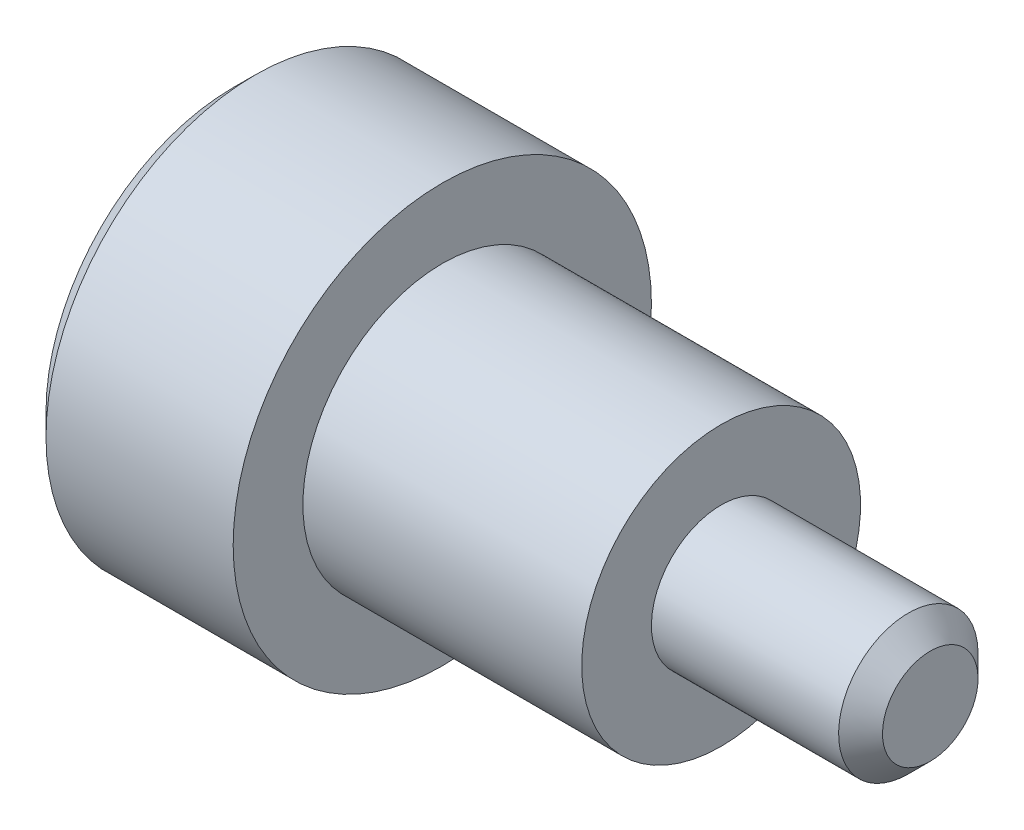
ISO-10303-21;
HEADER;
FILE_DESCRIPTION(('STEP AP214'),'2;1');
FILE_NAME('part.step','',(''),(''),'','','');
FILE_SCHEMA(('AUTOMOTIVE_DESIGN { 1 0 10303 214 1 1 1 1 }'));
ENDSEC;
DATA;
#1=APPLICATION_CONTEXT('core data for automotive mechanical design processes');
#2=APPLICATION_PROTOCOL_DEFINITION('international standard','automotive_design',2000,#1);
#3=PRODUCT_CONTEXT('',#1,'mechanical');
#4=PRODUCT('Part','Part','',(#3));
#5=PRODUCT_RELATED_PRODUCT_CATEGORY('part','',(#4));
#6=PRODUCT_DEFINITION_FORMATION('','',#4);
#7=PRODUCT_DEFINITION_CONTEXT('part definition',#1,'design');
#8=PRODUCT_DEFINITION('design','',#6,#7);
#9=PRODUCT_DEFINITION_SHAPE('','',#8);
#10=(LENGTH_UNIT() NAMED_UNIT(*) SI_UNIT(.MILLI.,.METRE.));
#11=(NAMED_UNIT(*) PLANE_ANGLE_UNIT() SI_UNIT($,.RADIAN.));
#12=(NAMED_UNIT(*) SI_UNIT($,.STERADIAN.) SOLID_ANGLE_UNIT());
#13=UNCERTAINTY_MEASURE_WITH_UNIT(LENGTH_MEASURE(1.E-05),#10,'distance_accuracy_value','');
#14=(GEOMETRIC_REPRESENTATION_CONTEXT(3) GLOBAL_UNCERTAINTY_ASSIGNED_CONTEXT((#13)) GLOBAL_UNIT_ASSIGNED_CONTEXT((#10,
#11,#12)) REPRESENTATION_CONTEXT('',''));
#15=CARTESIAN_POINT('',(0.,0.,0.));
#16=DIRECTION('',(0.,0.,1.));
#17=DIRECTION('',(1.,0.,0.));
#18=AXIS2_PLACEMENT_3D('',#15,#16,#17);
#19=CARTESIAN_POINT('',(0.,0.,0.));
#20=DIRECTION('',(1.,0.,0.));
#21=DIRECTION('',(0.,1.,0.));
#22=AXIS2_PLACEMENT_3D('',#19,#20,#21);
#23=PLANE('',#22);
#24=CARTESIAN_POINT('',(0.,0.,0.));
#25=DIRECTION('',(-1.,0.,0.));
#26=DIRECTION('',(0.,-1.,0.));
#27=AXIS2_PLACEMENT_3D('',#24,#25,#26);
#28=CIRCLE('',#27,4.2625);
#29=CARTESIAN_POINT('',(0.,-4.2625,0.));
#30=VERTEX_POINT('',#29);
#31=EDGE_CURVE('E11',#30,#30,#28,.T.);
#32=ORIENTED_EDGE('',*,*,#31,.T.);
#33=EDGE_LOOP('',(#32));
#34=FACE_BOUND('',#33,.T.);
#35=DIRECTION('',(0.,-0.5,-0.866025403784438));
#36=VECTOR('',#35,1.);
#37=CARTESIAN_POINT('',(0.,-0.57735026918963,1.));
#38=LINE('',#37,#36);
#39=CARTESIAN_POINT('',(0.,-0.57735026918963,1.));
#40=VERTEX_POINT('',#39);
#41=CARTESIAN_POINT('',(0.,-1.15470053837927,0.));
#42=VERTEX_POINT('',#41);
#43=EDGE_CURVE('E218',#40,#42,#38,.T.);
#44=ORIENTED_EDGE('',*,*,#43,.T.);
#45=DIRECTION('',(0.,0.5,-0.866025403784438));
#46=VECTOR('',#45,1.);
#47=CARTESIAN_POINT('',(0.,-1.15470053837927,0.));
#48=LINE('',#47,#46);
#49=CARTESIAN_POINT('',(0.,-0.57735026918963,-1.00000000000004));
#50=VERTEX_POINT('',#49);
#51=EDGE_CURVE('E221',#42,#50,#48,.T.);
#52=ORIENTED_EDGE('',*,*,#51,.T.);
#53=DIRECTION('',(0.,1.,0.));
#54=VECTOR('',#53,1.);
#55=CARTESIAN_POINT('',(0.,-0.57735026918963,-1.00000000000004));
#56=LINE('',#55,#54);
#57=CARTESIAN_POINT('',(0.,0.57735026918963,-1.00000000000004));
#58=VERTEX_POINT('',#57);
#59=EDGE_CURVE('E237',#50,#58,#56,.T.);
#60=ORIENTED_EDGE('',*,*,#59,.T.);
#61=DIRECTION('',(0.,0.5,0.866025403784438));
#62=VECTOR('',#61,1.);
#63=CARTESIAN_POINT('',(0.,0.57735026918963,-1.00000000000004));
#64=LINE('',#63,#62);
#65=CARTESIAN_POINT('',(0.,1.15470053837927,0.));
#66=VERTEX_POINT('',#65);
#67=EDGE_CURVE('E116',#58,#66,#64,.T.);
#68=ORIENTED_EDGE('',*,*,#67,.T.);
#69=DIRECTION('',(0.,-0.5,0.866025403784438));
#70=VECTOR('',#69,1.);
#71=CARTESIAN_POINT('',(0.,1.15470053837927,0.));
#72=LINE('',#71,#70);
#73=CARTESIAN_POINT('',(0.,0.57735026918963,1.));
#74=VERTEX_POINT('',#73);
#75=EDGE_CURVE('E256',#66,#74,#72,.T.);
#76=ORIENTED_EDGE('',*,*,#75,.T.);
#77=DIRECTION('',(0.,-1.,0.));
#78=VECTOR('',#77,1.);
#79=CARTESIAN_POINT('',(0.,0.57735026918963,1.));
#80=LINE('',#79,#78);
#81=EDGE_CURVE('E131',#74,#40,#80,.T.);
#82=ORIENTED_EDGE('',*,*,#81,.T.);
#83=EDGE_LOOP('',(#44,#52,#60,#68,#76,#82));
#84=FACE_BOUND('',#83,.T.);
#85=ADVANCED_FACE('F33',(#34,#84),#23,.F.);
#86=CARTESIAN_POINT('',(0.499999999999997,0.,0.));
#87=DIRECTION('',(1.,0.,0.));
#88=DIRECTION('',(0.,1.,0.));
#89=AXIS2_PLACEMENT_3D('',#86,#87,#88);
#90=CONICAL_SURFACE('',#89,4.7625,0.785398163397453);
#91=ORIENTED_EDGE('',*,*,#31,.F.);
#92=EDGE_LOOP('',(#91));
#93=FACE_BOUND('',#92,.T.);
#94=CARTESIAN_POINT('',(0.499999999999997,0.,0.));
#95=DIRECTION('',(-1.,0.,0.));
#96=DIRECTION('',(0.,-1.,0.));
#97=AXIS2_PLACEMENT_3D('',#94,#95,#96);
#98=CIRCLE('',#97,4.7625);
#99=CARTESIAN_POINT('',(0.499999999999998,-4.7625,0.));
#100=VERTEX_POINT('',#99);
#101=EDGE_CURVE('E40',#100,#100,#98,.T.);
#102=ORIENTED_EDGE('',*,*,#101,.T.);
#103=EDGE_LOOP('',(#102));
#104=FACE_BOUND('',#103,.T.);
#105=ADVANCED_FACE('F163',(#93,#104),#90,.T.);
#106=CARTESIAN_POINT('',(15.875,0.,0.));
#107=DIRECTION('',(-1.,0.,0.));
#108=DIRECTION('',(0.,-1.,0.));
#109=AXIS2_PLACEMENT_3D('',#106,#107,#108);
#110=CYLINDRICAL_SURFACE('',#109,4.7625);
#111=ORIENTED_EDGE('',*,*,#101,.F.);
#112=EDGE_LOOP('',(#111));
#113=FACE_BOUND('',#112,.T.);
#114=CARTESIAN_POINT('',(4.7625,0.,0.));
#115=DIRECTION('',(-1.,0.,0.));
#116=DIRECTION('',(0.,-1.,0.));
#117=AXIS2_PLACEMENT_3D('',#114,#115,#116);
#118=CIRCLE('',#117,4.7625);
#119=CARTESIAN_POINT('',(4.7625,-4.7625,0.));
#120=VERTEX_POINT('',#119);
#121=EDGE_CURVE('E158',#120,#120,#118,.T.);
#122=ORIENTED_EDGE('',*,*,#121,.T.);
#123=EDGE_LOOP('',(#122));
#124=FACE_BOUND('',#123,.T.);
#125=ADVANCED_FACE('F165',(#113,#124),#110,.T.);
#126=CARTESIAN_POINT('',(4.7625,4.7625,0.));
#127=DIRECTION('',(-1.,0.,0.));
#128=DIRECTION('',(0.,-1.,0.));
#129=AXIS2_PLACEMENT_3D('',#126,#127,#128);
#130=PLANE('',#129);
#131=ORIENTED_EDGE('',*,*,#121,.F.);
#132=EDGE_LOOP('',(#131));
#133=FACE_BOUND('',#132,.T.);
#134=CARTESIAN_POINT('',(4.7625,0.,0.));
#135=DIRECTION('',(-1.,0.,0.));
#136=DIRECTION('',(0.,-1.,0.));
#137=AXIS2_PLACEMENT_3D('',#134,#135,#136);
#138=CIRCLE('',#137,3.175);
#139=CARTESIAN_POINT('',(4.7625,-3.175,0.));
#140=VERTEX_POINT('',#139);
#141=EDGE_CURVE('E155',#140,#140,#138,.T.);
#142=ORIENTED_EDGE('',*,*,#141,.T.);
#143=EDGE_LOOP('',(#142));
#144=FACE_BOUND('',#143,.T.);
#145=ADVANCED_FACE('F168',(#133,#144),#130,.F.);
#146=CARTESIAN_POINT('',(15.875,0.,0.));
#147=DIRECTION('',(-1.,0.,0.));
#148=DIRECTION('',(0.,-1.,0.));
#149=AXIS2_PLACEMENT_3D('',#146,#147,#148);
#150=CYLINDRICAL_SURFACE('',#149,3.175);
#151=ORIENTED_EDGE('',*,*,#141,.F.);
#152=EDGE_LOOP('',(#151));
#153=FACE_BOUND('',#152,.T.);
#154=CARTESIAN_POINT('',(11.1125,0.,0.));
#155=DIRECTION('',(-1.,0.,0.));
#156=DIRECTION('',(0.,-1.,0.));
#157=AXIS2_PLACEMENT_3D('',#154,#155,#156);
#158=CIRCLE('',#157,3.175);
#159=CARTESIAN_POINT('',(11.1125,-3.175,0.));
#160=VERTEX_POINT('',#159);
#161=EDGE_CURVE('E152',#160,#160,#158,.T.);
#162=ORIENTED_EDGE('',*,*,#161,.T.);
#163=EDGE_LOOP('',(#162));
#164=FACE_BOUND('',#163,.T.);
#165=ADVANCED_FACE('F174',(#153,#164),#150,.T.);
#166=CARTESIAN_POINT('',(11.1125,3.175,0.));
#167=DIRECTION('',(-1.,0.,0.));
#168=DIRECTION('',(0.,-1.,0.));
#169=AXIS2_PLACEMENT_3D('',#166,#167,#168);
#170=PLANE('',#169);
#171=ORIENTED_EDGE('',*,*,#161,.F.);
#172=EDGE_LOOP('',(#171));
#173=FACE_BOUND('',#172,.T.);
#174=CARTESIAN_POINT('',(11.1125,0.,0.));
#175=DIRECTION('',(-1.,0.,0.));
#176=DIRECTION('',(0.,-1.,0.));
#177=AXIS2_PLACEMENT_3D('',#174,#175,#176);
#178=CIRCLE('',#177,1.5875);
#179=CARTESIAN_POINT('',(11.1125,-1.5875,0.));
#180=VERTEX_POINT('',#179);
#181=EDGE_CURVE('E149',#180,#180,#178,.T.);
#182=ORIENTED_EDGE('',*,*,#181,.T.);
#183=EDGE_LOOP('',(#182));
#184=FACE_BOUND('',#183,.T.);
#185=ADVANCED_FACE('F180',(#173,#184),#170,.F.);
#186=CARTESIAN_POINT('',(15.875,0.,0.));
#187=DIRECTION('',(-1.,0.,0.));
#188=DIRECTION('',(0.,-1.,0.));
#189=AXIS2_PLACEMENT_3D('',#186,#187,#188);
#190=CYLINDRICAL_SURFACE('',#189,1.5875);
#191=ORIENTED_EDGE('',*,*,#181,.F.);
#192=EDGE_LOOP('',(#191));
#193=FACE_BOUND('',#192,.T.);
#194=CARTESIAN_POINT('',(15.375,0.,0.));
#195=DIRECTION('',(-1.,0.,0.));
#196=DIRECTION('',(0.,-1.,0.));
#197=AXIS2_PLACEMENT_3D('',#194,#195,#196);
#198=CIRCLE('',#197,1.5875);
#199=CARTESIAN_POINT('',(15.375,-1.5875,0.));
#200=VERTEX_POINT('',#199);
#201=EDGE_CURVE('E146',#200,#200,#198,.T.);
#202=ORIENTED_EDGE('',*,*,#201,.T.);
#203=EDGE_LOOP('',(#202));
#204=FACE_BOUND('',#203,.T.);
#205=ADVANCED_FACE('F186',(#193,#204),#190,.T.);
#206=CARTESIAN_POINT('',(15.875,0.,0.));
#207=DIRECTION('',(-1.,0.,0.));
#208=DIRECTION('',(0.,-1.,0.));
#209=AXIS2_PLACEMENT_3D('',#206,#207,#208);
#210=CONICAL_SURFACE('',#209,1.0875,0.785398163397447);
#211=ORIENTED_EDGE('',*,*,#201,.F.);
#212=EDGE_LOOP('',(#211));
#213=FACE_BOUND('',#212,.T.);
#214=CARTESIAN_POINT('',(15.875,0.,0.));
#215=DIRECTION('',(-1.,0.,0.));
#216=DIRECTION('',(0.,-1.,0.));
#217=AXIS2_PLACEMENT_3D('',#214,#215,#216);
#218=CIRCLE('',#217,1.0875);
#219=CARTESIAN_POINT('',(15.875,-1.0875,0.));
#220=VERTEX_POINT('',#219);
#221=EDGE_CURVE('E143',#220,#220,#218,.T.);
#222=ORIENTED_EDGE('',*,*,#221,.T.);
#223=EDGE_LOOP('',(#222));
#224=FACE_BOUND('',#223,.T.);
#225=ADVANCED_FACE('F192',(#213,#224),#210,.T.);
#226=CARTESIAN_POINT('',(15.875,1.0875,0.));
#227=DIRECTION('',(-1.,0.,0.));
#228=DIRECTION('',(0.,-1.,0.));
#229=AXIS2_PLACEMENT_3D('',#226,#227,#228);
#230=PLANE('',#229);
#231=ORIENTED_EDGE('',*,*,#221,.F.);
#232=EDGE_LOOP('',(#231));
#233=FACE_BOUND('',#232,.T.);
#234=ADVANCED_FACE('F198',(#233),#230,.F.);
#235=CARTESIAN_POINT('',(2.,1.15470053837927,0.));
#236=DIRECTION('',(0.,-0.866025403784439,-0.5));
#237=DIRECTION('',(0.,0.5,-0.866025403784438));
#238=AXIS2_PLACEMENT_3D('',#235,#236,#237);
#239=PLANE('',#238);
#240=DIRECTION('',(0.,-0.5,0.866025403784438));
#241=VECTOR('',#240,1.);
#242=CARTESIAN_POINT('',(2.,1.15470053837927,0.));
#243=LINE('',#242,#241);
#244=CARTESIAN_POINT('',(2.,1.15470053837927,0.));
#245=VERTEX_POINT('',#244);
#246=CARTESIAN_POINT('',(2.,0.866025403784442,0.500000000000002));
#247=VERTEX_POINT('',#246);
#248=EDGE_CURVE('E113',#245,#247,#243,.T.);
#249=ORIENTED_EDGE('',*,*,#248,.T.);
#250=CARTESIAN_POINT('',(2.,0.57735026918963,1.));
#251=VERTEX_POINT('',#250);
#252=EDGE_CURVE('E105',#247,#251,#243,.T.);
#253=ORIENTED_EDGE('',*,*,#252,.T.);
#254=DIRECTION('',(-1.,0.,0.));
#255=VECTOR('',#254,1.);
#256=CARTESIAN_POINT('',(2.,0.57735026918963,1.));
#257=LINE('',#256,#255);
#258=EDGE_CURVE('E110',#251,#74,#257,.T.);
#259=ORIENTED_EDGE('',*,*,#258,.T.);
#260=ORIENTED_EDGE('',*,*,#75,.F.);
#261=DIRECTION('',(-1.,0.,0.));
#262=VECTOR('',#261,1.);
#263=CARTESIAN_POINT('',(2.,1.15470053837927,0.));
#264=LINE('',#263,#262);
#265=EDGE_CURVE('E243',#245,#66,#264,.T.);
#266=ORIENTED_EDGE('',*,*,#265,.F.);
#267=EDGE_LOOP('',(#249,#253,#259,#260,#266));
#268=FACE_BOUND('',#267,.T.);
#269=ADVANCED_FACE('F107',(#268),#239,.T.);
#270=CARTESIAN_POINT('',(2.,0.57735026918963,1.));
#271=DIRECTION('',(0.,0.,-1.));
#272=DIRECTION('',(-1.,0.,0.));
#273=AXIS2_PLACEMENT_3D('',#270,#271,#272);
#274=PLANE('',#273);
#275=DIRECTION('',(0.,-1.,0.));
#276=VECTOR('',#275,1.);
#277=CARTESIAN_POINT('',(2.,0.57735026918963,1.));
#278=LINE('',#277,#276);
#279=CARTESIAN_POINT('',(2.,0.,1.));
#280=VERTEX_POINT('',#279);
#281=EDGE_CURVE('E119',#251,#280,#278,.T.);
#282=ORIENTED_EDGE('',*,*,#281,.T.);
#283=CARTESIAN_POINT('',(2.,-0.57735026918963,1.));
#284=VERTEX_POINT('',#283);
#285=EDGE_CURVE('E126',#280,#284,#278,.T.);
#286=ORIENTED_EDGE('',*,*,#285,.T.);
#287=DIRECTION('',(-1.,0.,0.));
#288=VECTOR('',#287,1.);
#289=CARTESIAN_POINT('',(2.,-0.57735026918963,1.));
#290=LINE('',#289,#288);
#291=EDGE_CURVE('E133',#284,#40,#290,.T.);
#292=ORIENTED_EDGE('',*,*,#291,.T.);
#293=ORIENTED_EDGE('',*,*,#81,.F.);
#294=ORIENTED_EDGE('',*,*,#258,.F.);
#295=EDGE_LOOP('',(#282,#286,#292,#293,#294));
#296=FACE_BOUND('',#295,.T.);
#297=ADVANCED_FACE('F129',(#296),#274,.T.);
#298=CARTESIAN_POINT('',(2.,-0.57735026918963,1.));
#299=DIRECTION('',(0.,0.866025403784439,-0.5));
#300=DIRECTION('',(0.,0.5,0.866025403784438));
#301=AXIS2_PLACEMENT_3D('',#298,#299,#300);
#302=PLANE('',#301);
#303=DIRECTION('',(0.,-0.5,-0.866025403784438));
#304=VECTOR('',#303,1.);
#305=CARTESIAN_POINT('',(2.,-0.57735026918963,1.));
#306=LINE('',#305,#304);
#307=CARTESIAN_POINT('',(2.,-0.866025403784441,0.500000000000002));
#308=VERTEX_POINT('',#307);
#309=EDGE_CURVE('E266',#284,#308,#306,.T.);
#310=ORIENTED_EDGE('',*,*,#309,.T.);
#311=CARTESIAN_POINT('',(2.,-1.15470053837927,0.));
#312=VERTEX_POINT('',#311);
#313=EDGE_CURVE('E125',#308,#312,#306,.T.);
#314=ORIENTED_EDGE('',*,*,#313,.T.);
#315=DIRECTION('',(-1.,0.,0.));
#316=VECTOR('',#315,1.);
#317=CARTESIAN_POINT('',(2.,-1.15470053837927,0.));
#318=LINE('',#317,#316);
#319=EDGE_CURVE('E139',#312,#42,#318,.T.);
#320=ORIENTED_EDGE('',*,*,#319,.T.);
#321=ORIENTED_EDGE('',*,*,#43,.F.);
#322=ORIENTED_EDGE('',*,*,#291,.F.);
#323=EDGE_LOOP('',(#310,#314,#320,#321,#322));
#324=FACE_BOUND('',#323,.T.);
#325=ADVANCED_FACE('F228',(#324),#302,.T.);
#326=CARTESIAN_POINT('',(2.,-1.15470053837927,0.));
#327=DIRECTION('',(0.,0.866025403784439,0.5));
#328=DIRECTION('',(0.,-0.5,0.866025403784439));
#329=AXIS2_PLACEMENT_3D('',#326,#327,#328);
#330=PLANE('',#329);
#331=DIRECTION('',(0.,0.5,-0.866025403784438));
#332=VECTOR('',#331,1.);
#333=CARTESIAN_POINT('',(2.,-1.15470053837927,0.));
#334=LINE('',#333,#332);
#335=CARTESIAN_POINT('',(2.,-0.866025403784458,-0.500000000000011));
#336=VERTEX_POINT('',#335);
#337=EDGE_CURVE('E263',#312,#336,#334,.T.);
#338=ORIENTED_EDGE('',*,*,#337,.T.);
#339=CARTESIAN_POINT('',(2.,-0.57735026918963,-1.00000000000004));
#340=VERTEX_POINT('',#339);
#341=EDGE_CURVE('E265',#336,#340,#334,.T.);
#342=ORIENTED_EDGE('',*,*,#341,.T.);
#343=DIRECTION('',(-1.,0.,0.));
#344=VECTOR('',#343,1.);
#345=CARTESIAN_POINT('',(2.,-0.57735026918963,-1.00000000000004));
#346=LINE('',#345,#344);
#347=EDGE_CURVE('E233',#340,#50,#346,.T.);
#348=ORIENTED_EDGE('',*,*,#347,.T.);
#349=ORIENTED_EDGE('',*,*,#51,.F.);
#350=ORIENTED_EDGE('',*,*,#319,.F.);
#351=EDGE_LOOP('',(#338,#342,#348,#349,#350));
#352=FACE_BOUND('',#351,.T.);
#353=ADVANCED_FACE('F234',(#352),#330,.T.);
#354=CARTESIAN_POINT('',(2.,-0.57735026918963,-1.00000000000004));
#355=DIRECTION('',(0.,0.,1.));
#356=DIRECTION('',(1.,0.,0.));
#357=AXIS2_PLACEMENT_3D('',#354,#355,#356);
#358=PLANE('',#357);
#359=DIRECTION('',(0.,1.,0.));
#360=VECTOR('',#359,1.);
#361=CARTESIAN_POINT('',(2.,-0.57735026918963,-1.00000000000004));
#362=LINE('',#361,#360);
#363=CARTESIAN_POINT('',(2.,0.,-1.00000000000004));
#364=VERTEX_POINT('',#363);
#365=EDGE_CURVE('E261',#340,#364,#362,.T.);
#366=ORIENTED_EDGE('',*,*,#365,.T.);
#367=CARTESIAN_POINT('',(2.,0.57735026918963,-1.00000000000004));
#368=VERTEX_POINT('',#367);
#369=EDGE_CURVE('E254',#364,#368,#362,.T.);
#370=ORIENTED_EDGE('',*,*,#369,.T.);
#371=DIRECTION('',(-1.,0.,0.));
#372=VECTOR('',#371,1.);
#373=CARTESIAN_POINT('',(2.,0.57735026918963,-1.00000000000004));
#374=LINE('',#373,#372);
#375=EDGE_CURVE('E246',#368,#58,#374,.T.);
#376=ORIENTED_EDGE('',*,*,#375,.T.);
#377=ORIENTED_EDGE('',*,*,#59,.F.);
#378=ORIENTED_EDGE('',*,*,#347,.F.);
#379=EDGE_LOOP('',(#366,#370,#376,#377,#378));
#380=FACE_BOUND('',#379,.T.);
#381=ADVANCED_FACE('F252',(#380),#358,.T.);
#382=CARTESIAN_POINT('',(2.,0.57735026918963,-1.00000000000004));
#383=DIRECTION('',(0.,-0.866025403784438,0.5));
#384=DIRECTION('',(0.,-0.5,-0.866025403784439));
#385=AXIS2_PLACEMENT_3D('',#382,#383,#384);
#386=PLANE('',#385);
#387=DIRECTION('',(0.,0.5,0.866025403784438));
#388=VECTOR('',#387,1.);
#389=CARTESIAN_POINT('',(2.,0.57735026918963,-1.00000000000004));
#390=LINE('',#389,#388);
#391=CARTESIAN_POINT('',(2.,0.866025403784438,-0.5));
#392=VERTEX_POINT('',#391);
#393=EDGE_CURVE('E47',#368,#392,#390,.T.);
#394=ORIENTED_EDGE('',*,*,#393,.T.);
#395=EDGE_CURVE('E260',#392,#245,#390,.T.);
#396=ORIENTED_EDGE('',*,*,#395,.T.);
#397=ORIENTED_EDGE('',*,*,#265,.T.);
#398=ORIENTED_EDGE('',*,*,#67,.F.);
#399=ORIENTED_EDGE('',*,*,#375,.F.);
#400=EDGE_LOOP('',(#394,#396,#397,#398,#399));
#401=FACE_BOUND('',#400,.T.);
#402=ADVANCED_FACE('F255',(#401),#386,.T.);
#403=CARTESIAN_POINT('',(2.,0.57735026918963,1.));
#404=DIRECTION('',(1.,0.,0.));
#405=DIRECTION('',(0.,1.,0.));
#406=AXIS2_PLACEMENT_3D('',#403,#404,#405);
#407=PLANE('',#406);
#408=CARTESIAN_POINT('',(2.,0.,0.));
#409=DIRECTION('',(-1.,0.,0.));
#410=DIRECTION('',(0.,-1.,0.));
#411=AXIS2_PLACEMENT_3D('',#408,#409,#410);
#412=CIRCLE('',#411,1.);
#413=EDGE_CURVE('E121',#280,#247,#412,.T.);
#414=ORIENTED_EDGE('',*,*,#413,.F.);
#415=ORIENTED_EDGE('',*,*,#281,.F.);
#416=ORIENTED_EDGE('',*,*,#252,.F.);
#417=EDGE_LOOP('',(#414,#415,#416));
#418=FACE_BOUND('',#417,.T.);
#419=ADVANCED_FACE('F120',(#418),#407,.F.);
#420=EDGE_CURVE('E138',#308,#280,#412,.T.);
#421=ORIENTED_EDGE('',*,*,#420,.F.);
#422=ORIENTED_EDGE('',*,*,#309,.F.);
#423=ORIENTED_EDGE('',*,*,#285,.F.);
#424=EDGE_LOOP('',(#421,#422,#423));
#425=FACE_BOUND('',#424,.T.);
#426=ADVANCED_FACE('F269',(#425),#407,.F.);
#427=EDGE_CURVE('E132',#336,#308,#412,.T.);
#428=ORIENTED_EDGE('',*,*,#427,.F.);
#429=ORIENTED_EDGE('',*,*,#337,.F.);
#430=ORIENTED_EDGE('',*,*,#313,.F.);
#431=EDGE_LOOP('',(#428,#429,#430));
#432=FACE_BOUND('',#431,.T.);
#433=ADVANCED_FACE('F272',(#432),#407,.F.);
#434=EDGE_CURVE('E136',#364,#336,#412,.T.);
#435=ORIENTED_EDGE('',*,*,#434,.F.);
#436=ORIENTED_EDGE('',*,*,#365,.F.);
#437=ORIENTED_EDGE('',*,*,#341,.F.);
#438=EDGE_LOOP('',(#435,#436,#437));
#439=FACE_BOUND('',#438,.T.);
#440=ADVANCED_FACE('F287',(#439),#407,.F.);
#441=EDGE_CURVE('E279',#392,#364,#412,.T.);
#442=ORIENTED_EDGE('',*,*,#441,.F.);
#443=ORIENTED_EDGE('',*,*,#393,.F.);
#444=ORIENTED_EDGE('',*,*,#369,.F.);
#445=EDGE_LOOP('',(#442,#443,#444));
#446=FACE_BOUND('',#445,.T.);
#447=ADVANCED_FACE('F286',(#446),#407,.F.);
#448=EDGE_CURVE('E282',#247,#392,#412,.T.);
#449=ORIENTED_EDGE('',*,*,#448,.F.);
#450=ORIENTED_EDGE('',*,*,#248,.F.);
#451=ORIENTED_EDGE('',*,*,#395,.F.);
#452=EDGE_LOOP('',(#449,#450,#451));
#453=FACE_BOUND('',#452,.T.);
#454=ADVANCED_FACE('F284',(#453),#407,.F.);
#455=CARTESIAN_POINT('',(2.57735026918963,0.,0.));
#456=DIRECTION('',(-1.,0.,0.));
#457=DIRECTION('',(0.,-1.,0.));
#458=AXIS2_PLACEMENT_3D('',#455,#456,#457);
#459=CONICAL_SURFACE('',#458,0.,1.04719755119659);
#460=ORIENTED_EDGE('',*,*,#420,.T.);
#461=ORIENTED_EDGE('',*,*,#413,.T.);
#462=ORIENTED_EDGE('',*,*,#448,.T.);
#463=ORIENTED_EDGE('',*,*,#441,.T.);
#464=ORIENTED_EDGE('',*,*,#434,.T.);
#465=ORIENTED_EDGE('',*,*,#427,.T.);
#466=EDGE_LOOP('',(#460,#461,#462,#463,#464,#465));
#467=FACE_BOUND('',#466,.T.);
#468=CARTESIAN_POINT('',(2.57735026918963,0.,0.));
#469=VERTEX_POINT('',#468);
#470=VERTEX_LOOP('',#469);
#471=FACE_BOUND('',#470,.T.);
#472=ADVANCED_FACE('F276',(#467,#471),#459,.F.);
#473=CLOSED_SHELL('',(#85,#105,#125,#145,#165,#185,#205,#225,#234,#269,#297,#325,#353,#381,#402,
#419,#426,#433,#440,#447,#454,#472));
#474=MANIFOLD_SOLID_BREP('B2',#473);
#475=ADVANCED_BREP_SHAPE_REPRESENTATION('',(#18,#474),#14);
#476=SHAPE_DEFINITION_REPRESENTATION(#9,#475);
ENDSEC;
END-ISO-10303-21;
